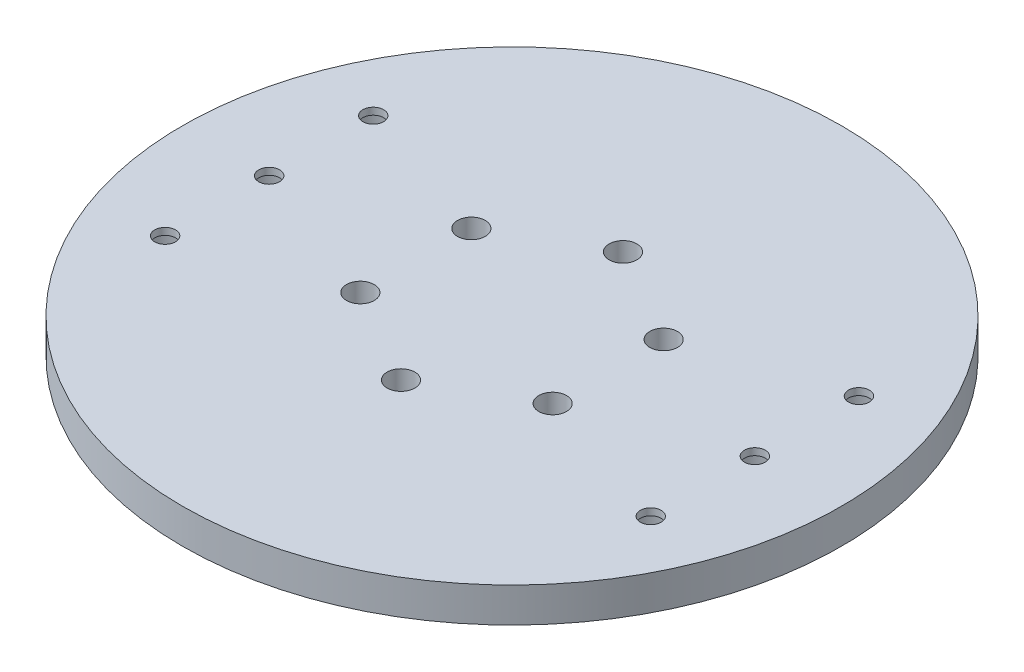
ISO-10303-21;
HEADER;
FILE_DESCRIPTION(('STEP AP214'),'2;1');
FILE_NAME('part.step','',(''),(''),'','','');
FILE_SCHEMA(('AUTOMOTIVE_DESIGN { 1 0 10303 214 1 1 1 1 }'));
ENDSEC;
DATA;
#1=APPLICATION_CONTEXT('core data for automotive mechanical design processes');
#2=APPLICATION_PROTOCOL_DEFINITION('international standard','automotive_design',2000,#1);
#3=PRODUCT_CONTEXT('',#1,'mechanical');
#4=PRODUCT('Part','Part','',(#3));
#5=PRODUCT_RELATED_PRODUCT_CATEGORY('part','',(#4));
#6=PRODUCT_DEFINITION_FORMATION('','',#4);
#7=PRODUCT_DEFINITION_CONTEXT('part definition',#1,'design');
#8=PRODUCT_DEFINITION('design','',#6,#7);
#9=PRODUCT_DEFINITION_SHAPE('','',#8);
#10=(LENGTH_UNIT() NAMED_UNIT(*) SI_UNIT(.MILLI.,.METRE.));
#11=(NAMED_UNIT(*) PLANE_ANGLE_UNIT() SI_UNIT($,.RADIAN.));
#12=(NAMED_UNIT(*) SI_UNIT($,.STERADIAN.) SOLID_ANGLE_UNIT());
#13=UNCERTAINTY_MEASURE_WITH_UNIT(LENGTH_MEASURE(1.E-05),#10,'distance_accuracy_value','');
#14=(GEOMETRIC_REPRESENTATION_CONTEXT(3) GLOBAL_UNCERTAINTY_ASSIGNED_CONTEXT((#13)) GLOBAL_UNIT_ASSIGNED_CONTEXT((#10,
#11,#12)) REPRESENTATION_CONTEXT('',''));
#15=CARTESIAN_POINT('',(0.,0.,0.));
#16=DIRECTION('',(0.,0.,1.));
#17=DIRECTION('',(1.,0.,0.));
#18=AXIS2_PLACEMENT_3D('',#15,#16,#17);
#19=CARTESIAN_POINT('',(-35.,0.,15.));
#20=DIRECTION('',(0.,1.,0.));
#21=DIRECTION('',(0.,0.,1.));
#22=AXIS2_PLACEMENT_3D('',#19,#20,#21);
#23=CYLINDRICAL_SURFACE('',#22,1.5);
#24=CARTESIAN_POINT('',(-35.,8.7,15.));
#25=DIRECTION('',(0.,1.,0.));
#26=DIRECTION('',(0.,0.,1.));
#27=AXIS2_PLACEMENT_3D('',#24,#25,#26);
#28=CIRCLE('',#27,1.5);
#29=CARTESIAN_POINT('',(-35.,8.7,16.5));
#30=VERTEX_POINT('',#29);
#31=EDGE_CURVE('E118',#30,#30,#28,.T.);
#32=ORIENTED_EDGE('',*,*,#31,.T.);
#33=EDGE_LOOP('',(#32));
#34=FACE_BOUND('',#33,.T.);
#35=CARTESIAN_POINT('',(-35.,7.7,15.));
#36=DIRECTION('',(0.,-1.,0.));
#37=DIRECTION('',(0.,0.,-1.));
#38=AXIS2_PLACEMENT_3D('',#35,#36,#37);
#39=CIRCLE('',#38,1.5);
#40=CARTESIAN_POINT('',(-35.,7.7,13.5));
#41=VERTEX_POINT('',#40);
#42=EDGE_CURVE('E168',#41,#41,#39,.T.);
#43=ORIENTED_EDGE('',*,*,#42,.T.);
#44=EDGE_LOOP('',(#43));
#45=FACE_BOUND('',#44,.T.);
#46=ADVANCED_FACE('F45',(#34,#45),#23,.F.);
#47=CARTESIAN_POINT('',(-35.,0.,0.));
#48=DIRECTION('',(0.,1.,0.));
#49=DIRECTION('',(0.,0.,1.));
#50=AXIS2_PLACEMENT_3D('',#47,#48,#49);
#51=CYLINDRICAL_SURFACE('',#50,1.5);
#52=CARTESIAN_POINT('',(-35.,8.7,0.));
#53=DIRECTION('',(0.,1.,0.));
#54=DIRECTION('',(0.,0.,1.));
#55=AXIS2_PLACEMENT_3D('',#52,#53,#54);
#56=CIRCLE('',#55,1.5);
#57=CARTESIAN_POINT('',(-35.,8.7,1.5));
#58=VERTEX_POINT('',#57);
#59=EDGE_CURVE('E122',#58,#58,#56,.T.);
#60=ORIENTED_EDGE('',*,*,#59,.T.);
#61=EDGE_LOOP('',(#60));
#62=FACE_BOUND('',#61,.T.);
#63=CARTESIAN_POINT('',(-35.,7.7,0.));
#64=DIRECTION('',(0.,-1.,0.));
#65=DIRECTION('',(0.,0.,-1.));
#66=AXIS2_PLACEMENT_3D('',#63,#64,#65);
#67=CIRCLE('',#66,1.5);
#68=CARTESIAN_POINT('',(-35.,7.7,-1.50000000000001));
#69=VERTEX_POINT('',#68);
#70=EDGE_CURVE('E154',#69,#69,#67,.T.);
#71=ORIENTED_EDGE('',*,*,#70,.T.);
#72=EDGE_LOOP('',(#71));
#73=FACE_BOUND('',#72,.T.);
#74=ADVANCED_FACE('F240',(#62,#73),#51,.F.);
#75=CARTESIAN_POINT('',(-35.,0.,-15.));
#76=DIRECTION('',(0.,1.,0.));
#77=DIRECTION('',(0.,0.,1.));
#78=AXIS2_PLACEMENT_3D('',#75,#76,#77);
#79=CYLINDRICAL_SURFACE('',#78,1.5);
#80=CARTESIAN_POINT('',(-35.,8.7,-15.));
#81=DIRECTION('',(0.,1.,0.));
#82=DIRECTION('',(0.,0.,1.));
#83=AXIS2_PLACEMENT_3D('',#80,#81,#82);
#84=CIRCLE('',#83,1.5);
#85=CARTESIAN_POINT('',(-35.,8.7,-13.5));
#86=VERTEX_POINT('',#85);
#87=EDGE_CURVE('E117',#86,#86,#84,.T.);
#88=ORIENTED_EDGE('',*,*,#87,.T.);
#89=EDGE_LOOP('',(#88));
#90=FACE_BOUND('',#89,.T.);
#91=CARTESIAN_POINT('',(-35.,7.7,-15.));
#92=DIRECTION('',(0.,-1.,0.));
#93=DIRECTION('',(0.,0.,-1.));
#94=AXIS2_PLACEMENT_3D('',#91,#92,#93);
#95=CIRCLE('',#94,1.5);
#96=CARTESIAN_POINT('',(-35.,7.7,-16.5));
#97=VERTEX_POINT('',#96);
#98=EDGE_CURVE('E164',#97,#97,#95,.T.);
#99=ORIENTED_EDGE('',*,*,#98,.T.);
#100=EDGE_LOOP('',(#99));
#101=FACE_BOUND('',#100,.T.);
#102=ADVANCED_FACE('F246',(#90,#101),#79,.F.);
#103=CARTESIAN_POINT('',(35.,0.,15.));
#104=DIRECTION('',(0.,1.,0.));
#105=DIRECTION('',(0.,0.,1.));
#106=AXIS2_PLACEMENT_3D('',#103,#104,#105);
#107=CYLINDRICAL_SURFACE('',#106,1.5);
#108=CARTESIAN_POINT('',(35.,8.7,15.));
#109=DIRECTION('',(0.,-1.,0.));
#110=DIRECTION('',(0.,0.,1.));
#111=AXIS2_PLACEMENT_3D('',#108,#109,#110);
#112=CIRCLE('',#111,1.5);
#113=CARTESIAN_POINT('',(35.,8.7,16.5));
#114=VERTEX_POINT('',#113);
#115=EDGE_CURVE('E130',#114,#114,#112,.T.);
#116=ORIENTED_EDGE('',*,*,#115,.F.);
#117=EDGE_LOOP('',(#116));
#118=FACE_BOUND('',#117,.T.);
#119=CARTESIAN_POINT('',(35.,7.7,15.));
#120=DIRECTION('',(0.,-1.,0.));
#121=DIRECTION('',(0.,0.,-1.));
#122=AXIS2_PLACEMENT_3D('',#119,#120,#121);
#123=CIRCLE('',#122,1.5);
#124=CARTESIAN_POINT('',(35.,7.7,13.5));
#125=VERTEX_POINT('',#124);
#126=EDGE_CURVE('E146',#125,#125,#123,.T.);
#127=ORIENTED_EDGE('',*,*,#126,.T.);
#128=EDGE_LOOP('',(#127));
#129=FACE_BOUND('',#128,.T.);
#130=ADVANCED_FACE('F333',(#118,#129),#107,.F.);
#131=CARTESIAN_POINT('',(35.,0.,0.));
#132=DIRECTION('',(0.,1.,0.));
#133=DIRECTION('',(0.,0.,1.));
#134=AXIS2_PLACEMENT_3D('',#131,#132,#133);
#135=CYLINDRICAL_SURFACE('',#134,1.5);
#136=CARTESIAN_POINT('',(35.,8.7,0.));
#137=DIRECTION('',(0.,-1.,0.));
#138=DIRECTION('',(0.,0.,1.));
#139=AXIS2_PLACEMENT_3D('',#136,#137,#138);
#140=CIRCLE('',#139,1.5);
#141=CARTESIAN_POINT('',(35.,8.7,1.5));
#142=VERTEX_POINT('',#141);
#143=EDGE_CURVE('E134',#142,#142,#140,.T.);
#144=ORIENTED_EDGE('',*,*,#143,.F.);
#145=EDGE_LOOP('',(#144));
#146=FACE_BOUND('',#145,.T.);
#147=CARTESIAN_POINT('',(35.,7.7,0.));
#148=DIRECTION('',(0.,-1.,0.));
#149=DIRECTION('',(0.,0.,-1.));
#150=AXIS2_PLACEMENT_3D('',#147,#148,#149);
#151=CIRCLE('',#150,1.5);
#152=CARTESIAN_POINT('',(35.,7.7,-1.50000000000001));
#153=VERTEX_POINT('',#152);
#154=EDGE_CURVE('E153',#153,#153,#151,.T.);
#155=ORIENTED_EDGE('',*,*,#154,.T.);
#156=EDGE_LOOP('',(#155));
#157=FACE_BOUND('',#156,.T.);
#158=ADVANCED_FACE('F327',(#146,#157),#135,.F.);
#159=CARTESIAN_POINT('',(35.,0.,-15.));
#160=DIRECTION('',(0.,1.,0.));
#161=DIRECTION('',(0.,0.,1.));
#162=AXIS2_PLACEMENT_3D('',#159,#160,#161);
#163=CYLINDRICAL_SURFACE('',#162,1.5);
#164=CARTESIAN_POINT('',(35.,8.7,-15.));
#165=DIRECTION('',(0.,-1.,0.));
#166=DIRECTION('',(0.,0.,1.));
#167=AXIS2_PLACEMENT_3D('',#164,#165,#166);
#168=CIRCLE('',#167,1.5);
#169=CARTESIAN_POINT('',(35.,8.7,-13.5));
#170=VERTEX_POINT('',#169);
#171=EDGE_CURVE('E123',#170,#170,#168,.T.);
#172=ORIENTED_EDGE('',*,*,#171,.F.);
#173=EDGE_LOOP('',(#172));
#174=FACE_BOUND('',#173,.T.);
#175=CARTESIAN_POINT('',(35.,7.7,-15.));
#176=DIRECTION('',(0.,-1.,0.));
#177=DIRECTION('',(0.,0.,-1.));
#178=AXIS2_PLACEMENT_3D('',#175,#176,#177);
#179=CIRCLE('',#178,1.5);
#180=CARTESIAN_POINT('',(35.,7.7,-16.5));
#181=VERTEX_POINT('',#180);
#182=EDGE_CURVE('E179',#181,#181,#179,.T.);
#183=ORIENTED_EDGE('',*,*,#182,.T.);
#184=EDGE_LOOP('',(#183));
#185=FACE_BOUND('',#184,.T.);
#186=ADVANCED_FACE('F322',(#174,#185),#163,.F.);
#187=CARTESIAN_POINT('',(0.,3.7,0.));
#188=DIRECTION('',(0.,-1.,0.));
#189=DIRECTION('',(0.,0.,-1.));
#190=AXIS2_PLACEMENT_3D('',#187,#188,#189);
#191=CYLINDRICAL_SURFACE('',#190,24.5);
#192=CARTESIAN_POINT('',(0.,3.7,0.));
#193=DIRECTION('',(0.,1.,0.));
#194=DIRECTION('',(0.,0.,1.));
#195=AXIS2_PLACEMENT_3D('',#192,#193,#194);
#196=CIRCLE('',#195,24.5);
#197=CARTESIAN_POINT('',(0.,3.7,24.5));
#198=VERTEX_POINT('',#197);
#199=EDGE_CURVE('E10',#198,#198,#196,.T.);
#200=ORIENTED_EDGE('',*,*,#199,.F.);
#201=EDGE_LOOP('',(#200));
#202=FACE_BOUND('',#201,.T.);
#203=CARTESIAN_POINT('',(0.,0.,0.));
#204=DIRECTION('',(0.,1.,0.));
#205=DIRECTION('',(0.,0.,1.));
#206=AXIS2_PLACEMENT_3D('',#203,#204,#205);
#207=CIRCLE('',#206,24.5);
#208=CARTESIAN_POINT('',(0.,0.,24.5));
#209=VERTEX_POINT('',#208);
#210=EDGE_CURVE('E49',#209,#209,#207,.T.);
#211=ORIENTED_EDGE('',*,*,#210,.T.);
#212=EDGE_LOOP('',(#211));
#213=FACE_BOUND('',#212,.T.);
#214=ADVANCED_FACE('F47',(#202,#213),#191,.T.);
#215=CARTESIAN_POINT('',(0.,0.,0.));
#216=DIRECTION('',(0.,1.,0.));
#217=DIRECTION('',(0.,0.,1.));
#218=AXIS2_PLACEMENT_3D('',#215,#216,#217);
#219=PLANE('',#218);
#220=CARTESIAN_POINT('',(13.8564064605509,0.,-8.00000000000016));
#221=DIRECTION('',(0.,1.,0.));
#222=DIRECTION('',(-0.866025403784433,0.,0.50000000000001));
#223=AXIS2_PLACEMENT_3D('',#220,#221,#222);
#224=CIRCLE('',#223,2.);
#225=CARTESIAN_POINT('',(12.1243556529821,0.,-7.00000000000014));
#226=VERTEX_POINT('',#225);
#227=EDGE_CURVE('E71',#226,#226,#224,.T.);
#228=ORIENTED_EDGE('',*,*,#227,.T.);
#229=EDGE_LOOP('',(#228));
#230=FACE_BOUND('',#229,.T.);
#231=CARTESIAN_POINT('',(13.8564064605511,0.,7.99999999999987));
#232=DIRECTION('',(0.,1.,0.));
#233=DIRECTION('',(-0.866025403784443,0.,-0.499999999999992));
#234=AXIS2_PLACEMENT_3D('',#231,#232,#233);
#235=CIRCLE('',#234,2.);
#236=CARTESIAN_POINT('',(12.1243556529822,0.,6.99999999999989));
#237=VERTEX_POINT('',#236);
#238=EDGE_CURVE('E75',#237,#237,#235,.T.);
#239=ORIENTED_EDGE('',*,*,#238,.T.);
#240=EDGE_LOOP('',(#239));
#241=FACE_BOUND('',#240,.T.);
#242=CARTESIAN_POINT('',(0.,0.,16.));
#243=DIRECTION('',(0.,1.,0.));
#244=DIRECTION('',(0.,0.,-1.));
#245=AXIS2_PLACEMENT_3D('',#242,#243,#244);
#246=CIRCLE('',#245,2.);
#247=CARTESIAN_POINT('',(0.,0.,14.));
#248=VERTEX_POINT('',#247);
#249=EDGE_CURVE('E80',#248,#248,#246,.T.);
#250=ORIENTED_EDGE('',*,*,#249,.T.);
#251=EDGE_LOOP('',(#250));
#252=FACE_BOUND('',#251,.T.);
#253=CARTESIAN_POINT('',(-13.856406460551,0.,8.00000000000007));
#254=DIRECTION('',(0.,1.,0.));
#255=DIRECTION('',(0.866025403784436,0.,-0.500000000000004));
#256=AXIS2_PLACEMENT_3D('',#253,#254,#255);
#257=CIRCLE('',#256,2.);
#258=CARTESIAN_POINT('',(-12.1243556529821,0.,7.00000000000006));
#259=VERTEX_POINT('',#258);
#260=EDGE_CURVE('E70',#259,#259,#257,.T.);
#261=ORIENTED_EDGE('',*,*,#260,.T.);
#262=EDGE_LOOP('',(#261));
#263=FACE_BOUND('',#262,.T.);
#264=CARTESIAN_POINT('',(-13.856406460551,0.,-7.99999999999997));
#265=DIRECTION('',(0.,1.,0.));
#266=DIRECTION('',(0.86602540378444,0.,0.499999999999998));
#267=AXIS2_PLACEMENT_3D('',#264,#265,#266);
#268=CIRCLE('',#267,2.);
#269=CARTESIAN_POINT('',(-12.1243556529822,0.,-6.99999999999997));
#270=VERTEX_POINT('',#269);
#271=EDGE_CURVE('E66',#270,#270,#268,.T.);
#272=ORIENTED_EDGE('',*,*,#271,.T.);
#273=EDGE_LOOP('',(#272));
#274=FACE_BOUND('',#273,.T.);
#275=CARTESIAN_POINT('',(0.,0.,-16.));
#276=DIRECTION('',(0.,1.,0.));
#277=DIRECTION('',(0.,0.,1.));
#278=AXIS2_PLACEMENT_3D('',#275,#276,#277);
#279=CIRCLE('',#278,2.);
#280=CARTESIAN_POINT('',(0.,0.,-14.));
#281=VERTEX_POINT('',#280);
#282=EDGE_CURVE('E61',#281,#281,#279,.T.);
#283=ORIENTED_EDGE('',*,*,#282,.T.);
#284=EDGE_LOOP('',(#283));
#285=FACE_BOUND('',#284,.T.);
#286=ORIENTED_EDGE('',*,*,#210,.F.);
#287=EDGE_LOOP('',(#286));
#288=FACE_BOUND('',#287,.T.);
#289=ADVANCED_FACE('F289',(#230,#241,#252,#263,#274,#285,#288),#219,.F.);
#290=CARTESIAN_POINT('',(0.,0.,-16.));
#291=DIRECTION('',(0.,1.,0.));
#292=DIRECTION('',(0.,0.,1.));
#293=AXIS2_PLACEMENT_3D('',#290,#291,#292);
#294=CYLINDRICAL_SURFACE('',#293,2.);
#295=ORIENTED_EDGE('',*,*,#282,.F.);
#296=EDGE_LOOP('',(#295));
#297=FACE_BOUND('',#296,.T.);
#298=CARTESIAN_POINT('',(0.,8.7,-16.));
#299=DIRECTION('',(0.,1.,0.));
#300=DIRECTION('',(0.,0.,1.));
#301=AXIS2_PLACEMENT_3D('',#298,#299,#300);
#302=CIRCLE('',#301,2.);
#303=CARTESIAN_POINT('',(0.,8.7,-14.));
#304=VERTEX_POINT('',#303);
#305=EDGE_CURVE('E113',#304,#304,#302,.T.);
#306=ORIENTED_EDGE('',*,*,#305,.T.);
#307=EDGE_LOOP('',(#306));
#308=FACE_BOUND('',#307,.T.);
#309=ADVANCED_FACE('F286',(#297,#308),#294,.F.);
#310=CARTESIAN_POINT('',(-13.856406460551,0.,-7.99999999999997));
#311=DIRECTION('',(0.,1.,0.));
#312=DIRECTION('',(0.,0.,1.));
#313=AXIS2_PLACEMENT_3D('',#310,#311,#312);
#314=CYLINDRICAL_SURFACE('',#313,2.);
#315=ORIENTED_EDGE('',*,*,#271,.F.);
#316=EDGE_LOOP('',(#315));
#317=FACE_BOUND('',#316,.T.);
#318=CARTESIAN_POINT('',(-13.856406460551,8.7,-7.99999999999997));
#319=DIRECTION('',(0.,1.,0.));
#320=DIRECTION('',(0.,0.,1.));
#321=AXIS2_PLACEMENT_3D('',#318,#319,#320);
#322=CIRCLE('',#321,2.);
#323=CARTESIAN_POINT('',(-13.856406460551,8.7,-5.99999999999997));
#324=VERTEX_POINT('',#323);
#325=EDGE_CURVE('E109',#324,#324,#322,.T.);
#326=ORIENTED_EDGE('',*,*,#325,.T.);
#327=EDGE_LOOP('',(#326));
#328=FACE_BOUND('',#327,.T.);
#329=ADVANCED_FACE('F288',(#317,#328),#314,.F.);
#330=CARTESIAN_POINT('',(-13.856406460551,0.,8.00000000000007));
#331=DIRECTION('',(0.,1.,0.));
#332=DIRECTION('',(0.,0.,1.));
#333=AXIS2_PLACEMENT_3D('',#330,#331,#332);
#334=CYLINDRICAL_SURFACE('',#333,2.);
#335=ORIENTED_EDGE('',*,*,#260,.F.);
#336=EDGE_LOOP('',(#335));
#337=FACE_BOUND('',#336,.T.);
#338=CARTESIAN_POINT('',(-13.856406460551,8.7,8.00000000000007));
#339=DIRECTION('',(0.,1.,0.));
#340=DIRECTION('',(0.,0.,1.));
#341=AXIS2_PLACEMENT_3D('',#338,#339,#340);
#342=CIRCLE('',#341,2.);
#343=CARTESIAN_POINT('',(-13.856406460551,8.7,10.0000000000001));
#344=VERTEX_POINT('',#343);
#345=EDGE_CURVE('E105',#344,#344,#342,.T.);
#346=ORIENTED_EDGE('',*,*,#345,.T.);
#347=EDGE_LOOP('',(#346));
#348=FACE_BOUND('',#347,.T.);
#349=ADVANCED_FACE('F296',(#337,#348),#334,.F.);
#350=CARTESIAN_POINT('',(0.,0.,16.));
#351=DIRECTION('',(0.,1.,0.));
#352=DIRECTION('',(0.,0.,1.));
#353=AXIS2_PLACEMENT_3D('',#350,#351,#352);
#354=CYLINDRICAL_SURFACE('',#353,2.);
#355=ORIENTED_EDGE('',*,*,#249,.F.);
#356=EDGE_LOOP('',(#355));
#357=FACE_BOUND('',#356,.T.);
#358=CARTESIAN_POINT('',(0.,8.7,16.));
#359=DIRECTION('',(0.,1.,0.));
#360=DIRECTION('',(0.,0.,1.));
#361=AXIS2_PLACEMENT_3D('',#358,#359,#360);
#362=CIRCLE('',#361,2.);
#363=CARTESIAN_POINT('',(0.,8.7,18.));
#364=VERTEX_POINT('',#363);
#365=EDGE_CURVE('E101',#364,#364,#362,.T.);
#366=ORIENTED_EDGE('',*,*,#365,.T.);
#367=EDGE_LOOP('',(#366));
#368=FACE_BOUND('',#367,.T.);
#369=ADVANCED_FACE('F304',(#357,#368),#354,.F.);
#370=CARTESIAN_POINT('',(13.8564064605511,0.,7.99999999999987));
#371=DIRECTION('',(0.,1.,0.));
#372=DIRECTION('',(0.,0.,1.));
#373=AXIS2_PLACEMENT_3D('',#370,#371,#372);
#374=CYLINDRICAL_SURFACE('',#373,2.);
#375=ORIENTED_EDGE('',*,*,#238,.F.);
#376=EDGE_LOOP('',(#375));
#377=FACE_BOUND('',#376,.T.);
#378=CARTESIAN_POINT('',(13.8564064605511,8.7,7.99999999999987));
#379=DIRECTION('',(0.,1.,0.));
#380=DIRECTION('',(0.,0.,1.));
#381=AXIS2_PLACEMENT_3D('',#378,#379,#380);
#382=CIRCLE('',#381,2.);
#383=CARTESIAN_POINT('',(13.8564064605511,8.7,9.99999999999987));
#384=VERTEX_POINT('',#383);
#385=EDGE_CURVE('E97',#384,#384,#382,.T.);
#386=ORIENTED_EDGE('',*,*,#385,.T.);
#387=EDGE_LOOP('',(#386));
#388=FACE_BOUND('',#387,.T.);
#389=ADVANCED_FACE('F258',(#377,#388),#374,.F.);
#390=CARTESIAN_POINT('',(13.8564064605509,0.,-8.00000000000016));
#391=DIRECTION('',(0.,1.,0.));
#392=DIRECTION('',(0.,0.,1.));
#393=AXIS2_PLACEMENT_3D('',#390,#391,#392);
#394=CYLINDRICAL_SURFACE('',#393,2.);
#395=ORIENTED_EDGE('',*,*,#227,.F.);
#396=EDGE_LOOP('',(#395));
#397=FACE_BOUND('',#396,.T.);
#398=CARTESIAN_POINT('',(13.8564064605509,8.7,-8.00000000000016));
#399=DIRECTION('',(0.,1.,0.));
#400=DIRECTION('',(0.,0.,1.));
#401=AXIS2_PLACEMENT_3D('',#398,#399,#400);
#402=CIRCLE('',#401,2.);
#403=CARTESIAN_POINT('',(13.8564064605509,8.7,-6.00000000000016));
#404=VERTEX_POINT('',#403);
#405=EDGE_CURVE('E90',#404,#404,#402,.T.);
#406=ORIENTED_EDGE('',*,*,#405,.T.);
#407=EDGE_LOOP('',(#406));
#408=FACE_BOUND('',#407,.T.);
#409=ADVANCED_FACE('F253',(#397,#408),#394,.F.);
#410=CARTESIAN_POINT('',(0.,8.7,0.));
#411=DIRECTION('',(0.,1.,0.));
#412=DIRECTION('',(0.,0.,1.));
#413=AXIS2_PLACEMENT_3D('',#410,#411,#412);
#414=PLANE('',#413);
#415=ORIENTED_EDGE('',*,*,#171,.T.);
#416=EDGE_LOOP('',(#415));
#417=FACE_BOUND('',#416,.T.);
#418=ORIENTED_EDGE('',*,*,#143,.T.);
#419=EDGE_LOOP('',(#418));
#420=FACE_BOUND('',#419,.T.);
#421=ORIENTED_EDGE('',*,*,#115,.T.);
#422=EDGE_LOOP('',(#421));
#423=FACE_BOUND('',#422,.T.);
#424=ORIENTED_EDGE('',*,*,#87,.F.);
#425=EDGE_LOOP('',(#424));
#426=FACE_BOUND('',#425,.T.);
#427=ORIENTED_EDGE('',*,*,#59,.F.);
#428=EDGE_LOOP('',(#427));
#429=FACE_BOUND('',#428,.T.);
#430=ORIENTED_EDGE('',*,*,#31,.F.);
#431=EDGE_LOOP('',(#430));
#432=FACE_BOUND('',#431,.T.);
#433=ORIENTED_EDGE('',*,*,#325,.F.);
#434=EDGE_LOOP('',(#433));
#435=FACE_BOUND('',#434,.T.);
#436=ORIENTED_EDGE('',*,*,#365,.F.);
#437=EDGE_LOOP('',(#436));
#438=FACE_BOUND('',#437,.T.);
#439=ORIENTED_EDGE('',*,*,#405,.F.);
#440=EDGE_LOOP('',(#439));
#441=FACE_BOUND('',#440,.T.);
#442=CARTESIAN_POINT('',(0.,8.7,0.));
#443=DIRECTION('',(0.,1.,0.));
#444=DIRECTION('',(0.,0.,1.));
#445=AXIS2_PLACEMENT_3D('',#442,#443,#444);
#446=CIRCLE('',#445,47.5);
#447=CARTESIAN_POINT('',(0.,8.7,47.5));
#448=VERTEX_POINT('',#447);
#449=EDGE_CURVE('E76',#448,#448,#446,.T.);
#450=ORIENTED_EDGE('',*,*,#449,.T.);
#451=EDGE_LOOP('',(#450));
#452=FACE_BOUND('',#451,.T.);
#453=ORIENTED_EDGE('',*,*,#385,.F.);
#454=EDGE_LOOP('',(#453));
#455=FACE_BOUND('',#454,.T.);
#456=ORIENTED_EDGE('',*,*,#345,.F.);
#457=EDGE_LOOP('',(#456));
#458=FACE_BOUND('',#457,.T.);
#459=ORIENTED_EDGE('',*,*,#305,.F.);
#460=EDGE_LOOP('',(#459));
#461=FACE_BOUND('',#460,.T.);
#462=ADVANCED_FACE('F220',(#417,#420,#423,#426,#429,#432,#435,#438,#441,#452,#455,#458,#461),
#414,.T.);
#463=CARTESIAN_POINT('',(0.,3.7,0.));
#464=DIRECTION('',(0.,1.,0.));
#465=DIRECTION('',(0.,0.,1.));
#466=AXIS2_PLACEMENT_3D('',#463,#464,#465);
#467=PLANE('',#466);
#468=CARTESIAN_POINT('',(35.,3.7,0.));
#469=DIRECTION('',(0.,-1.,0.));
#470=DIRECTION('',(0.,0.,-1.));
#471=AXIS2_PLACEMENT_3D('',#468,#469,#470);
#472=CIRCLE('',#471,3.5);
#473=CARTESIAN_POINT('',(35.,3.7,-3.5));
#474=VERTEX_POINT('',#473);
#475=EDGE_CURVE('E194',#474,#474,#472,.T.);
#476=ORIENTED_EDGE('',*,*,#475,.F.);
#477=EDGE_LOOP('',(#476));
#478=FACE_BOUND('',#477,.T.);
#479=CARTESIAN_POINT('',(35.,3.7,-15.));
#480=DIRECTION('',(0.,-1.,0.));
#481=DIRECTION('',(0.,0.,-1.));
#482=AXIS2_PLACEMENT_3D('',#479,#480,#481);
#483=CIRCLE('',#482,3.5);
#484=CARTESIAN_POINT('',(35.,3.7,-18.5));
#485=VERTEX_POINT('',#484);
#486=EDGE_CURVE('E184',#485,#485,#483,.T.);
#487=ORIENTED_EDGE('',*,*,#486,.F.);
#488=EDGE_LOOP('',(#487));
#489=FACE_BOUND('',#488,.T.);
#490=CARTESIAN_POINT('',(-35.,3.7,15.));
#491=DIRECTION('',(0.,-1.,0.));
#492=DIRECTION('',(0.,0.,-1.));
#493=AXIS2_PLACEMENT_3D('',#490,#491,#492);
#494=CIRCLE('',#493,3.5);
#495=CARTESIAN_POINT('',(-35.,3.7,11.5));
#496=VERTEX_POINT('',#495);
#497=EDGE_CURVE('E172',#496,#496,#494,.T.);
#498=ORIENTED_EDGE('',*,*,#497,.F.);
#499=EDGE_LOOP('',(#498));
#500=FACE_BOUND('',#499,.T.);
#501=CARTESIAN_POINT('',(-35.,3.7,0.));
#502=DIRECTION('',(0.,-1.,0.));
#503=DIRECTION('',(0.,0.,-1.));
#504=AXIS2_PLACEMENT_3D('',#501,#502,#503);
#505=CIRCLE('',#504,3.5);
#506=CARTESIAN_POINT('',(-35.,3.7,-3.5));
#507=VERTEX_POINT('',#506);
#508=EDGE_CURVE('E159',#507,#507,#505,.T.);
#509=ORIENTED_EDGE('',*,*,#508,.F.);
#510=EDGE_LOOP('',(#509));
#511=FACE_BOUND('',#510,.T.);
#512=CARTESIAN_POINT('',(-35.,3.7,-15.));
#513=DIRECTION('',(0.,-1.,0.));
#514=DIRECTION('',(0.,0.,-1.));
#515=AXIS2_PLACEMENT_3D('',#512,#513,#514);
#516=CIRCLE('',#515,3.5);
#517=CARTESIAN_POINT('',(-35.,3.7,-18.5));
#518=VERTEX_POINT('',#517);
#519=EDGE_CURVE('E204',#518,#518,#516,.T.);
#520=ORIENTED_EDGE('',*,*,#519,.F.);
#521=EDGE_LOOP('',(#520));
#522=FACE_BOUND('',#521,.T.);
#523=CARTESIAN_POINT('',(35.,3.7,15.));
#524=DIRECTION('',(0.,-1.,0.));
#525=DIRECTION('',(0.,0.,-1.));
#526=AXIS2_PLACEMENT_3D('',#523,#524,#525);
#527=CIRCLE('',#526,3.5);
#528=CARTESIAN_POINT('',(35.,3.7,11.5));
#529=VERTEX_POINT('',#528);
#530=EDGE_CURVE('E142',#529,#529,#527,.T.);
#531=ORIENTED_EDGE('',*,*,#530,.F.);
#532=EDGE_LOOP('',(#531));
#533=FACE_BOUND('',#532,.T.);
#534=ORIENTED_EDGE('',*,*,#199,.T.);
#535=EDGE_LOOP('',(#534));
#536=FACE_BOUND('',#535,.T.);
#537=CARTESIAN_POINT('',(0.,3.7,0.));
#538=DIRECTION('',(0.,1.,0.));
#539=DIRECTION('',(0.,0.,1.));
#540=AXIS2_PLACEMENT_3D('',#537,#538,#539);
#541=CIRCLE('',#540,47.5);
#542=CARTESIAN_POINT('',(0.,3.7,47.5));
#543=VERTEX_POINT('',#542);
#544=EDGE_CURVE('E86',#543,#543,#541,.T.);
#545=ORIENTED_EDGE('',*,*,#544,.F.);
#546=EDGE_LOOP('',(#545));
#547=FACE_BOUND('',#546,.T.);
#548=ADVANCED_FACE('F216',(#478,#489,#500,#511,#522,#533,#536,#547),#467,.F.);
#549=CARTESIAN_POINT('',(0.,8.7,0.));
#550=DIRECTION('',(0.,-1.,0.));
#551=DIRECTION('',(0.,0.,-1.));
#552=AXIS2_PLACEMENT_3D('',#549,#550,#551);
#553=CYLINDRICAL_SURFACE('',#552,47.5);
#554=ORIENTED_EDGE('',*,*,#449,.F.);
#555=EDGE_LOOP('',(#554));
#556=FACE_BOUND('',#555,.T.);
#557=ORIENTED_EDGE('',*,*,#544,.T.);
#558=EDGE_LOOP('',(#557));
#559=FACE_BOUND('',#558,.T.);
#560=ADVANCED_FACE('F219',(#556,#559),#553,.T.);
#561=CARTESIAN_POINT('',(35.,7.7,-15.));
#562=DIRECTION('',(0.,-1.,0.));
#563=DIRECTION('',(0.,0.,-1.));
#564=AXIS2_PLACEMENT_3D('',#561,#562,#563);
#565=CYLINDRICAL_SURFACE('',#564,3.5);
#566=CARTESIAN_POINT('',(35.,7.7,-15.));
#567=DIRECTION('',(0.,-1.,0.));
#568=DIRECTION('',(0.,0.,-1.));
#569=AXIS2_PLACEMENT_3D('',#566,#567,#568);
#570=CIRCLE('',#569,3.5);
#571=CARTESIAN_POINT('',(35.,7.7,-18.5));
#572=VERTEX_POINT('',#571);
#573=EDGE_CURVE('E171',#572,#572,#570,.T.);
#574=ORIENTED_EDGE('',*,*,#573,.F.);
#575=EDGE_LOOP('',(#574));
#576=FACE_BOUND('',#575,.T.);
#577=ORIENTED_EDGE('',*,*,#486,.T.);
#578=EDGE_LOOP('',(#577));
#579=FACE_BOUND('',#578,.T.);
#580=ADVANCED_FACE('F228',(#576,#579),#565,.F.);
#581=CARTESIAN_POINT('',(35.,7.7,-15.));
#582=DIRECTION('',(0.,-1.,0.));
#583=DIRECTION('',(0.,0.,-1.));
#584=AXIS2_PLACEMENT_3D('',#581,#582,#583);
#585=PLANE('',#584);
#586=ORIENTED_EDGE('',*,*,#182,.F.);
#587=EDGE_LOOP('',(#586));
#588=FACE_BOUND('',#587,.T.);
#589=ORIENTED_EDGE('',*,*,#573,.T.);
#590=EDGE_LOOP('',(#589));
#591=FACE_BOUND('',#590,.T.);
#592=ADVANCED_FACE('F234',(#588,#591),#585,.T.);
#593=CARTESIAN_POINT('',(35.,7.7,0.));
#594=DIRECTION('',(0.,-1.,0.));
#595=DIRECTION('',(0.,0.,-1.));
#596=AXIS2_PLACEMENT_3D('',#593,#594,#595);
#597=CYLINDRICAL_SURFACE('',#596,3.5);
#598=CARTESIAN_POINT('',(35.,7.7,0.));
#599=DIRECTION('',(0.,-1.,0.));
#600=DIRECTION('',(0.,0.,-1.));
#601=AXIS2_PLACEMENT_3D('',#598,#599,#600);
#602=CIRCLE('',#601,3.5);
#603=CARTESIAN_POINT('',(35.,7.7,-3.5));
#604=VERTEX_POINT('',#603);
#605=EDGE_CURVE('E183',#604,#604,#602,.T.);
#606=ORIENTED_EDGE('',*,*,#605,.F.);
#607=EDGE_LOOP('',(#606));
#608=FACE_BOUND('',#607,.T.);
#609=ORIENTED_EDGE('',*,*,#475,.T.);
#610=EDGE_LOOP('',(#609));
#611=FACE_BOUND('',#610,.T.);
#612=ADVANCED_FACE('F365',(#608,#611),#597,.F.);
#613=CARTESIAN_POINT('',(35.,7.7,0.));
#614=DIRECTION('',(0.,-1.,0.));
#615=DIRECTION('',(0.,0.,-1.));
#616=AXIS2_PLACEMENT_3D('',#613,#614,#615);
#617=PLANE('',#616);
#618=ORIENTED_EDGE('',*,*,#154,.F.);
#619=EDGE_LOOP('',(#618));
#620=FACE_BOUND('',#619,.T.);
#621=ORIENTED_EDGE('',*,*,#605,.T.);
#622=EDGE_LOOP('',(#621));
#623=FACE_BOUND('',#622,.T.);
#624=ADVANCED_FACE('F368',(#620,#623),#617,.T.);
#625=CARTESIAN_POINT('',(35.,7.7,15.));
#626=DIRECTION('',(0.,-1.,0.));
#627=DIRECTION('',(0.,0.,-1.));
#628=AXIS2_PLACEMENT_3D('',#625,#626,#627);
#629=CYLINDRICAL_SURFACE('',#628,3.5);
#630=CARTESIAN_POINT('',(35.,7.7,15.));
#631=DIRECTION('',(0.,-1.,0.));
#632=DIRECTION('',(0.,0.,-1.));
#633=AXIS2_PLACEMENT_3D('',#630,#631,#632);
#634=CIRCLE('',#633,3.5);
#635=CARTESIAN_POINT('',(35.,7.7,11.5));
#636=VERTEX_POINT('',#635);
#637=EDGE_CURVE('E135',#636,#636,#634,.T.);
#638=ORIENTED_EDGE('',*,*,#637,.F.);
#639=EDGE_LOOP('',(#638));
#640=FACE_BOUND('',#639,.T.);
#641=ORIENTED_EDGE('',*,*,#530,.T.);
#642=EDGE_LOOP('',(#641));
#643=FACE_BOUND('',#642,.T.);
#644=ADVANCED_FACE('F338',(#640,#643),#629,.F.);
#645=CARTESIAN_POINT('',(35.,7.7,15.));
#646=DIRECTION('',(0.,-1.,0.));
#647=DIRECTION('',(0.,0.,-1.));
#648=AXIS2_PLACEMENT_3D('',#645,#646,#647);
#649=PLANE('',#648);
#650=ORIENTED_EDGE('',*,*,#126,.F.);
#651=EDGE_LOOP('',(#650));
#652=FACE_BOUND('',#651,.T.);
#653=ORIENTED_EDGE('',*,*,#637,.T.);
#654=EDGE_LOOP('',(#653));
#655=FACE_BOUND('',#654,.T.);
#656=ADVANCED_FACE('F358',(#652,#655),#649,.T.);
#657=CARTESIAN_POINT('',(-35.,7.7,-15.));
#658=DIRECTION('',(0.,-1.,0.));
#659=DIRECTION('',(0.,0.,-1.));
#660=AXIS2_PLACEMENT_3D('',#657,#658,#659);
#661=CYLINDRICAL_SURFACE('',#660,3.5);
#662=CARTESIAN_POINT('',(-35.,7.7,-15.));
#663=DIRECTION('',(0.,-1.,0.));
#664=DIRECTION('',(0.,0.,-1.));
#665=AXIS2_PLACEMENT_3D('',#662,#663,#664);
#666=CIRCLE('',#665,3.5);
#667=CARTESIAN_POINT('',(-35.,7.7,-18.5));
#668=VERTEX_POINT('',#667);
#669=EDGE_CURVE('E205',#668,#668,#666,.T.);
#670=ORIENTED_EDGE('',*,*,#669,.F.);
#671=EDGE_LOOP('',(#670));
#672=FACE_BOUND('',#671,.T.);
#673=ORIENTED_EDGE('',*,*,#519,.T.);
#674=EDGE_LOOP('',(#673));
#675=FACE_BOUND('',#674,.T.);
#676=ADVANCED_FACE('F214',(#672,#675),#661,.F.);
#677=CARTESIAN_POINT('',(-35.,7.7,-15.));
#678=DIRECTION('',(0.,-1.,0.));
#679=DIRECTION('',(0.,0.,-1.));
#680=AXIS2_PLACEMENT_3D('',#677,#678,#679);
#681=PLANE('',#680);
#682=ORIENTED_EDGE('',*,*,#98,.F.);
#683=EDGE_LOOP('',(#682));
#684=FACE_BOUND('',#683,.T.);
#685=ORIENTED_EDGE('',*,*,#669,.T.);
#686=EDGE_LOOP('',(#685));
#687=FACE_BOUND('',#686,.T.);
#688=ADVANCED_FACE('F350',(#684,#687),#681,.T.);
#689=CARTESIAN_POINT('',(-35.,7.7,0.));
#690=DIRECTION('',(0.,-1.,0.));
#691=DIRECTION('',(0.,0.,-1.));
#692=AXIS2_PLACEMENT_3D('',#689,#690,#691);
#693=CYLINDRICAL_SURFACE('',#692,3.5);
#694=CARTESIAN_POINT('',(-35.,7.7,0.));
#695=DIRECTION('',(0.,-1.,0.));
#696=DIRECTION('',(0.,0.,-1.));
#697=AXIS2_PLACEMENT_3D('',#694,#695,#696);
#698=CIRCLE('',#697,3.5);
#699=CARTESIAN_POINT('',(-35.,7.7,-3.5));
#700=VERTEX_POINT('',#699);
#701=EDGE_CURVE('E160',#700,#700,#698,.T.);
#702=ORIENTED_EDGE('',*,*,#701,.F.);
#703=EDGE_LOOP('',(#702));
#704=FACE_BOUND('',#703,.T.);
#705=ORIENTED_EDGE('',*,*,#508,.T.);
#706=EDGE_LOOP('',(#705));
#707=FACE_BOUND('',#706,.T.);
#708=ADVANCED_FACE('F353',(#704,#707),#693,.F.);
#709=CARTESIAN_POINT('',(-35.,7.7,0.));
#710=DIRECTION('',(0.,-1.,0.));
#711=DIRECTION('',(0.,0.,-1.));
#712=AXIS2_PLACEMENT_3D('',#709,#710,#711);
#713=PLANE('',#712);
#714=ORIENTED_EDGE('',*,*,#70,.F.);
#715=EDGE_LOOP('',(#714));
#716=FACE_BOUND('',#715,.T.);
#717=ORIENTED_EDGE('',*,*,#701,.T.);
#718=EDGE_LOOP('',(#717));
#719=FACE_BOUND('',#718,.T.);
#720=ADVANCED_FACE('F380',(#716,#719),#713,.T.);
#721=CARTESIAN_POINT('',(-35.,7.7,15.));
#722=DIRECTION('',(0.,-1.,0.));
#723=DIRECTION('',(0.,0.,-1.));
#724=AXIS2_PLACEMENT_3D('',#721,#722,#723);
#725=CYLINDRICAL_SURFACE('',#724,3.5);
#726=CARTESIAN_POINT('',(-35.,7.7,15.));
#727=DIRECTION('',(0.,-1.,0.));
#728=DIRECTION('',(0.,0.,-1.));
#729=AXIS2_PLACEMENT_3D('',#726,#727,#728);
#730=CIRCLE('',#729,3.5);
#731=CARTESIAN_POINT('',(-35.,7.7,11.5));
#732=VERTEX_POINT('',#731);
#733=EDGE_CURVE('E158',#732,#732,#730,.T.);
#734=ORIENTED_EDGE('',*,*,#733,.F.);
#735=EDGE_LOOP('',(#734));
#736=FACE_BOUND('',#735,.T.);
#737=ORIENTED_EDGE('',*,*,#497,.T.);
#738=EDGE_LOOP('',(#737));
#739=FACE_BOUND('',#738,.T.);
#740=ADVANCED_FACE('F376',(#736,#739),#725,.F.);
#741=CARTESIAN_POINT('',(-35.,7.7,15.));
#742=DIRECTION('',(0.,-1.,0.));
#743=DIRECTION('',(0.,0.,-1.));
#744=AXIS2_PLACEMENT_3D('',#741,#742,#743);
#745=PLANE('',#744);
#746=ORIENTED_EDGE('',*,*,#42,.F.);
#747=EDGE_LOOP('',(#746));
#748=FACE_BOUND('',#747,.T.);
#749=ORIENTED_EDGE('',*,*,#733,.T.);
#750=EDGE_LOOP('',(#749));
#751=FACE_BOUND('',#750,.T.);
#752=ADVANCED_FACE('F379',(#748,#751),#745,.T.);
#753=CLOSED_SHELL('',(#46,#74,#102,#130,#158,#186,#214,#289,#309,#329,#349,#369,#389,#409,#462,
#548,#560,#580,#592,#612,#624,#644,#656,#676,#688,#708,#720,#740,#752));
#754=MANIFOLD_SOLID_BREP('B2',#753);
#755=ADVANCED_BREP_SHAPE_REPRESENTATION('',(#18,#754),#14);
#756=SHAPE_DEFINITION_REPRESENTATION(#9,#755);
ENDSEC;
END-ISO-10303-21;
